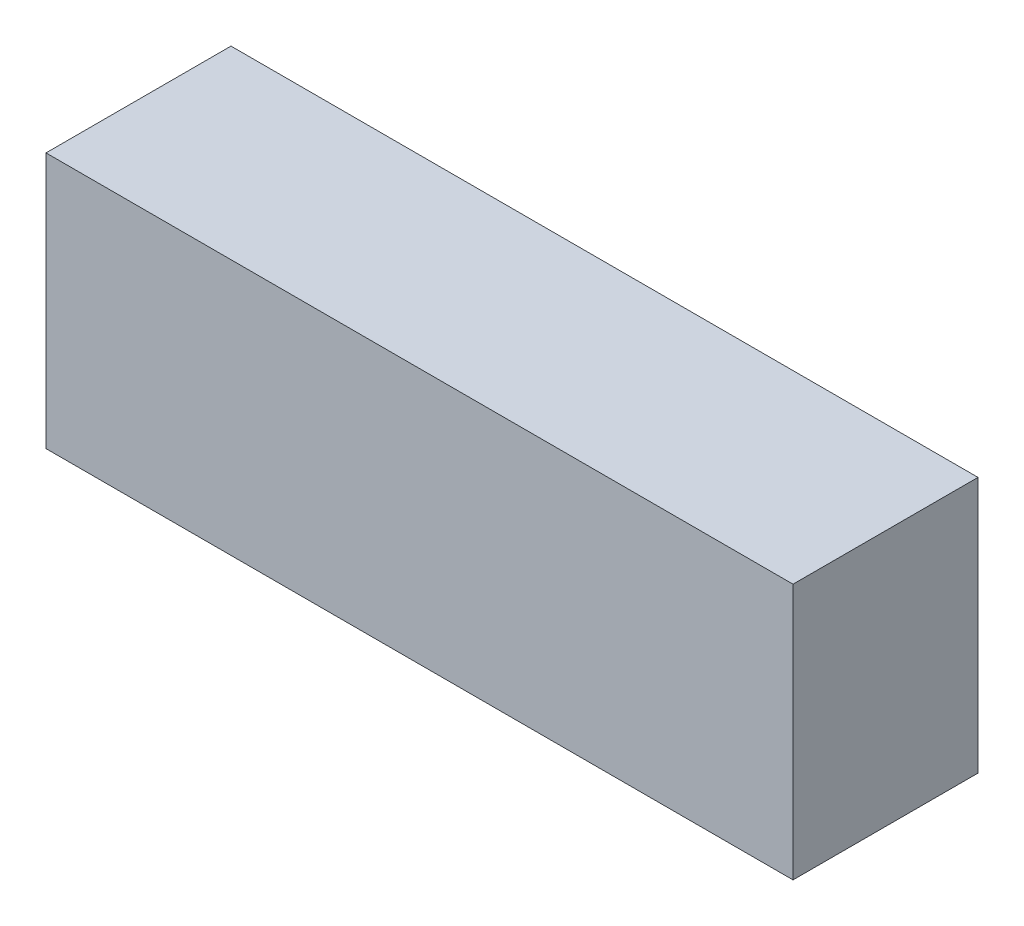
ISO-10303-21;
HEADER;
FILE_DESCRIPTION(('STEP AP214'),'2;1');
FILE_NAME('part.step','',(''),(''),'','','');
FILE_SCHEMA(('AUTOMOTIVE_DESIGN { 1 0 10303 214 1 1 1 1 }'));
ENDSEC;
DATA;
#1=APPLICATION_CONTEXT('core data for automotive mechanical design processes');
#2=APPLICATION_PROTOCOL_DEFINITION('international standard','automotive_design',2000,#1);
#3=PRODUCT_CONTEXT('',#1,'mechanical');
#4=PRODUCT('Part','Part','',(#3));
#5=PRODUCT_RELATED_PRODUCT_CATEGORY('part','',(#4));
#6=PRODUCT_DEFINITION_FORMATION('','',#4);
#7=PRODUCT_DEFINITION_CONTEXT('part definition',#1,'design');
#8=PRODUCT_DEFINITION('design','',#6,#7);
#9=PRODUCT_DEFINITION_SHAPE('','',#8);
#10=(LENGTH_UNIT() NAMED_UNIT(*) SI_UNIT(.MILLI.,.METRE.));
#11=(NAMED_UNIT(*) PLANE_ANGLE_UNIT() SI_UNIT($,.RADIAN.));
#12=(NAMED_UNIT(*) SI_UNIT($,.STERADIAN.) SOLID_ANGLE_UNIT());
#13=UNCERTAINTY_MEASURE_WITH_UNIT(LENGTH_MEASURE(1.E-05),#10,'distance_accuracy_value','');
#14=(GEOMETRIC_REPRESENTATION_CONTEXT(3) GLOBAL_UNCERTAINTY_ASSIGNED_CONTEXT((#13)) GLOBAL_UNIT_ASSIGNED_CONTEXT((#10,
#11,#12)) REPRESENTATION_CONTEXT('',''));
#15=CARTESIAN_POINT('',(0.,0.,0.));
#16=DIRECTION('',(0.,0.,1.));
#17=DIRECTION('',(1.,0.,0.));
#18=AXIS2_PLACEMENT_3D('',#15,#16,#17);
#19=CARTESIAN_POINT('',(52.5,-18.,26.));
#20=DIRECTION('',(-1.,0.,0.));
#21=DIRECTION('',(0.,0.,1.));
#22=AXIS2_PLACEMENT_3D('',#19,#20,#21);
#23=PLANE('',#22);
#24=DIRECTION('',(0.,1.,0.));
#25=VECTOR('',#24,1.);
#26=CARTESIAN_POINT('',(52.5,-18.,0.));
#27=LINE('',#26,#25);
#28=CARTESIAN_POINT('',(52.5,-18.,0.));
#29=VERTEX_POINT('',#28);
#30=CARTESIAN_POINT('',(52.5,18.,0.));
#31=VERTEX_POINT('',#30);
#32=EDGE_CURVE('E102',#29,#31,#27,.T.);
#33=ORIENTED_EDGE('',*,*,#32,.T.);
#34=DIRECTION('',(0.,0.,-1.));
#35=VECTOR('',#34,1.);
#36=CARTESIAN_POINT('',(52.5,18.,26.));
#37=LINE('',#36,#35);
#38=CARTESIAN_POINT('',(52.5,18.,26.));
#39=VERTEX_POINT('',#38);
#40=EDGE_CURVE('E11',#39,#31,#37,.T.);
#41=ORIENTED_EDGE('',*,*,#40,.F.);
#42=DIRECTION('',(0.,1.,0.));
#43=VECTOR('',#42,1.);
#44=CARTESIAN_POINT('',(52.5,-18.,26.));
#45=LINE('',#44,#43);
#46=CARTESIAN_POINT('',(52.5,-18.,26.));
#47=VERTEX_POINT('',#46);
#48=EDGE_CURVE('E90',#47,#39,#45,.T.);
#49=ORIENTED_EDGE('',*,*,#48,.F.);
#50=DIRECTION('',(0.,0.,-1.));
#51=VECTOR('',#50,1.);
#52=CARTESIAN_POINT('',(52.5,-18.,26.));
#53=LINE('',#52,#51);
#54=EDGE_CURVE('E98',#47,#29,#53,.T.);
#55=ORIENTED_EDGE('',*,*,#54,.T.);
#56=EDGE_LOOP('',(#33,#41,#49,#55));
#57=FACE_BOUND('',#56,.T.);
#58=ADVANCED_FACE('F39',(#57),#23,.F.);
#59=CARTESIAN_POINT('',(-52.5,18.,26.));
#60=DIRECTION('',(0.,-1.,0.));
#61=DIRECTION('',(0.,0.,-1.));
#62=AXIS2_PLACEMENT_3D('',#59,#60,#61);
#63=PLANE('',#62);
#64=DIRECTION('',(-1.,0.,0.));
#65=VECTOR('',#64,1.);
#66=CARTESIAN_POINT('',(-52.5,18.,0.));
#67=LINE('',#66,#65);
#68=CARTESIAN_POINT('',(-52.5,18.,0.));
#69=VERTEX_POINT('',#68);
#70=EDGE_CURVE('E94',#31,#69,#67,.T.);
#71=ORIENTED_EDGE('',*,*,#70,.T.);
#72=DIRECTION('',(0.,0.,-1.));
#73=VECTOR('',#72,1.);
#74=CARTESIAN_POINT('',(-52.5,18.,26.));
#75=LINE('',#74,#73);
#76=CARTESIAN_POINT('',(-52.5,18.,26.));
#77=VERTEX_POINT('',#76);
#78=EDGE_CURVE('E47',#77,#69,#75,.T.);
#79=ORIENTED_EDGE('',*,*,#78,.F.);
#80=DIRECTION('',(-1.,0.,0.));
#81=VECTOR('',#80,1.);
#82=CARTESIAN_POINT('',(-52.5,18.,26.));
#83=LINE('',#82,#81);
#84=EDGE_CURVE('E85',#39,#77,#83,.T.);
#85=ORIENTED_EDGE('',*,*,#84,.F.);
#86=ORIENTED_EDGE('',*,*,#40,.T.);
#87=EDGE_LOOP('',(#71,#79,#85,#86));
#88=FACE_BOUND('',#87,.T.);
#89=ADVANCED_FACE('F93',(#88),#63,.F.);
#90=CARTESIAN_POINT('',(-52.5,-18.,26.));
#91=DIRECTION('',(1.,0.,0.));
#92=DIRECTION('',(0.,0.,-1.));
#93=AXIS2_PLACEMENT_3D('',#90,#91,#92);
#94=PLANE('',#93);
#95=DIRECTION('',(0.,-1.,0.));
#96=VECTOR('',#95,1.);
#97=CARTESIAN_POINT('',(-52.5,-18.,0.));
#98=LINE('',#97,#96);
#99=CARTESIAN_POINT('',(-52.5,-18.,0.));
#100=VERTEX_POINT('',#99);
#101=EDGE_CURVE('E72',#69,#100,#98,.T.);
#102=ORIENTED_EDGE('',*,*,#101,.T.);
#103=DIRECTION('',(0.,0.,-1.));
#104=VECTOR('',#103,1.);
#105=CARTESIAN_POINT('',(-52.5,-18.,26.));
#106=LINE('',#105,#104);
#107=CARTESIAN_POINT('',(-52.5,-18.,26.));
#108=VERTEX_POINT('',#107);
#109=EDGE_CURVE('E95',#108,#100,#106,.T.);
#110=ORIENTED_EDGE('',*,*,#109,.F.);
#111=DIRECTION('',(0.,-1.,0.));
#112=VECTOR('',#111,1.);
#113=CARTESIAN_POINT('',(-52.5,-18.,26.));
#114=LINE('',#113,#112);
#115=EDGE_CURVE('E88',#77,#108,#114,.T.);
#116=ORIENTED_EDGE('',*,*,#115,.F.);
#117=ORIENTED_EDGE('',*,*,#78,.T.);
#118=EDGE_LOOP('',(#102,#110,#116,#117));
#119=FACE_BOUND('',#118,.T.);
#120=ADVANCED_FACE('F96',(#119),#94,.F.);
#121=CARTESIAN_POINT('',(-52.5,-18.,26.));
#122=DIRECTION('',(0.,1.,0.));
#123=DIRECTION('',(0.,0.,1.));
#124=AXIS2_PLACEMENT_3D('',#121,#122,#123);
#125=PLANE('',#124);
#126=DIRECTION('',(1.,0.,0.));
#127=VECTOR('',#126,1.);
#128=CARTESIAN_POINT('',(-52.5,-18.,0.));
#129=LINE('',#128,#127);
#130=EDGE_CURVE('E78',#100,#29,#129,.T.);
#131=ORIENTED_EDGE('',*,*,#130,.T.);
#132=ORIENTED_EDGE('',*,*,#54,.F.);
#133=DIRECTION('',(1.,0.,0.));
#134=VECTOR('',#133,1.);
#135=CARTESIAN_POINT('',(-52.5,-18.,26.));
#136=LINE('',#135,#134);
#137=EDGE_CURVE('E55',#108,#47,#136,.T.);
#138=ORIENTED_EDGE('',*,*,#137,.F.);
#139=ORIENTED_EDGE('',*,*,#109,.T.);
#140=EDGE_LOOP('',(#131,#132,#138,#139));
#141=FACE_BOUND('',#140,.T.);
#142=ADVANCED_FACE('F109',(#141),#125,.F.);
#143=CARTESIAN_POINT('',(0.,0.,26.));
#144=DIRECTION('',(0.,0.,-1.));
#145=DIRECTION('',(-1.,0.,0.));
#146=AXIS2_PLACEMENT_3D('',#143,#144,#145);
#147=PLANE('',#146);
#148=ORIENTED_EDGE('',*,*,#48,.T.);
#149=ORIENTED_EDGE('',*,*,#84,.T.);
#150=ORIENTED_EDGE('',*,*,#115,.T.);
#151=ORIENTED_EDGE('',*,*,#137,.T.);
#152=EDGE_LOOP('',(#148,#149,#150,#151));
#153=FACE_BOUND('',#152,.T.);
#154=ADVANCED_FACE('F86',(#153),#147,.F.);
#155=CARTESIAN_POINT('',(0.,0.,0.));
#156=DIRECTION('',(0.,0.,-1.));
#157=DIRECTION('',(-1.,0.,0.));
#158=AXIS2_PLACEMENT_3D('',#155,#156,#157);
#159=PLANE('',#158);
#160=ORIENTED_EDGE('',*,*,#32,.F.);
#161=ORIENTED_EDGE('',*,*,#130,.F.);
#162=ORIENTED_EDGE('',*,*,#101,.F.);
#163=ORIENTED_EDGE('',*,*,#70,.F.);
#164=EDGE_LOOP('',(#160,#161,#162,#163));
#165=FACE_BOUND('',#164,.T.);
#166=ADVANCED_FACE('F112',(#165),#159,.T.);
#167=CLOSED_SHELL('',(#58,#89,#120,#142,#154,#166));
#168=MANIFOLD_SOLID_BREP('B2',#167);
#169=ADVANCED_BREP_SHAPE_REPRESENTATION('',(#18,#168),#14);
#170=SHAPE_DEFINITION_REPRESENTATION(#9,#169);
ENDSEC;
END-ISO-10303-21;
